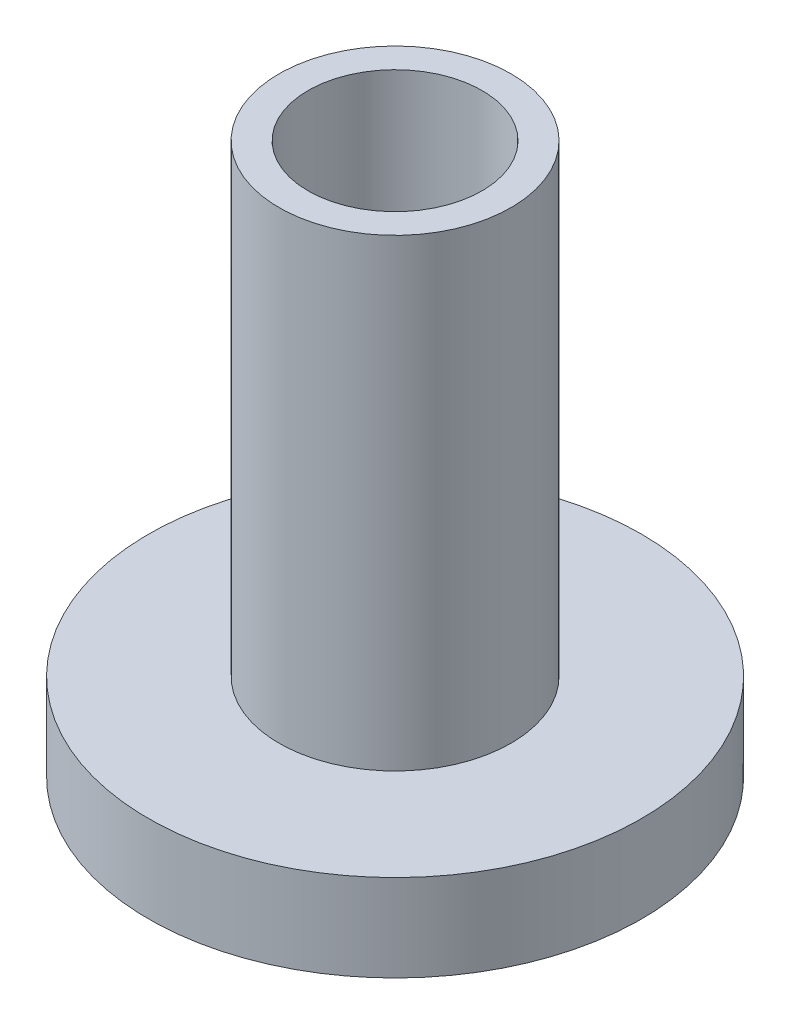
ISO-10303-21;
HEADER;
FILE_DESCRIPTION(('STEP AP214'),'2;1');
FILE_NAME('part.step','',(''),(''),'','','');
FILE_SCHEMA(('AUTOMOTIVE_DESIGN { 1 0 10303 214 1 1 1 1 }'));
ENDSEC;
DATA;
#1=APPLICATION_CONTEXT('core data for automotive mechanical design processes');
#2=APPLICATION_PROTOCOL_DEFINITION('international standard','automotive_design',2000,#1);
#3=PRODUCT_CONTEXT('',#1,'mechanical');
#4=PRODUCT('Part','Part','',(#3));
#5=PRODUCT_RELATED_PRODUCT_CATEGORY('part','',(#4));
#6=PRODUCT_DEFINITION_FORMATION('','',#4);
#7=PRODUCT_DEFINITION_CONTEXT('part definition',#1,'design');
#8=PRODUCT_DEFINITION('design','',#6,#7);
#9=PRODUCT_DEFINITION_SHAPE('','',#8);
#10=(LENGTH_UNIT() NAMED_UNIT(*) SI_UNIT(.MILLI.,.METRE.));
#11=(NAMED_UNIT(*) PLANE_ANGLE_UNIT() SI_UNIT($,.RADIAN.));
#12=(NAMED_UNIT(*) SI_UNIT($,.STERADIAN.) SOLID_ANGLE_UNIT());
#13=UNCERTAINTY_MEASURE_WITH_UNIT(LENGTH_MEASURE(1.E-05),#10,'distance_accuracy_value','');
#14=(GEOMETRIC_REPRESENTATION_CONTEXT(3) GLOBAL_UNCERTAINTY_ASSIGNED_CONTEXT((#13)) GLOBAL_UNIT_ASSIGNED_CONTEXT((#10,
#11,#12)) REPRESENTATION_CONTEXT('',''));
#15=CARTESIAN_POINT('',(0.,0.,0.));
#16=DIRECTION('',(0.,0.,1.));
#17=DIRECTION('',(1.,0.,0.));
#18=AXIS2_PLACEMENT_3D('',#15,#16,#17);
#19=CARTESIAN_POINT('',(0.,5.,0.));
#20=DIRECTION('',(0.,1.,0.));
#21=DIRECTION('',(0.,0.,1.));
#22=AXIS2_PLACEMENT_3D('',#19,#20,#21);
#23=PLANE('',#22);
#24=CARTESIAN_POINT('',(0.,5.,0.));
#25=DIRECTION('',(0.,1.,0.));
#26=DIRECTION('',(0.,0.,1.));
#27=AXIS2_PLACEMENT_3D('',#24,#25,#26);
#28=CIRCLE('',#27,1.5);
#29=CARTESIAN_POINT('',(0.,5.,1.5));
#30=VERTEX_POINT('',#29);
#31=EDGE_CURVE('E19',#30,#30,#28,.T.);
#32=ORIENTED_EDGE('',*,*,#31,.T.);
#33=EDGE_LOOP('',(#32));
#34=FACE_BOUND('',#33,.T.);
#35=ADVANCED_FACE('F16',(#34),#23,.T.);
#36=CARTESIAN_POINT('',(0.,5.,0.));
#37=DIRECTION('',(0.,1.,0.));
#38=DIRECTION('',(0.,0.,1.));
#39=AXIS2_PLACEMENT_3D('',#36,#37,#38);
#40=CYLINDRICAL_SURFACE('',#39,1.5);
#41=CARTESIAN_POINT('',(0.,9.5,0.));
#42=DIRECTION('',(0.,1.,0.));
#43=DIRECTION('',(0.,0.,1.));
#44=AXIS2_PLACEMENT_3D('',#41,#42,#43);
#45=CIRCLE('',#44,1.5);
#46=CARTESIAN_POINT('',(0.,9.5,1.5));
#47=VERTEX_POINT('',#46);
#48=EDGE_CURVE('E101',#47,#47,#45,.F.);
#49=ORIENTED_EDGE('',*,*,#48,.F.);
#50=EDGE_LOOP('',(#49));
#51=FACE_BOUND('',#50,.T.);
#52=ORIENTED_EDGE('',*,*,#31,.F.);
#53=EDGE_LOOP('',(#52));
#54=FACE_BOUND('',#53,.T.);
#55=ADVANCED_FACE('F109',(#51,#54),#40,.F.);
#56=CARTESIAN_POINT('',(0.,9.5,0.));
#57=DIRECTION('',(0.,1.,0.));
#58=DIRECTION('',(0.,0.,1.));
#59=AXIS2_PLACEMENT_3D('',#56,#57,#58);
#60=PLANE('',#59);
#61=CARTESIAN_POINT('',(0.,9.5,0.));
#62=DIRECTION('',(0.,-1.,0.));
#63=DIRECTION('',(0.,0.,-1.));
#64=AXIS2_PLACEMENT_3D('',#61,#62,#63);
#65=CIRCLE('',#64,2.);
#66=CARTESIAN_POINT('',(0.,9.5,-2.));
#67=VERTEX_POINT('',#66);
#68=EDGE_CURVE('E99',#67,#67,#65,.T.);
#69=ORIENTED_EDGE('',*,*,#68,.F.);
#70=EDGE_LOOP('',(#69));
#71=FACE_BOUND('',#70,.T.);
#72=ORIENTED_EDGE('',*,*,#48,.T.);
#73=EDGE_LOOP('',(#72));
#74=FACE_BOUND('',#73,.T.);
#75=ADVANCED_FACE('F111',(#71,#74),#60,.T.);
#76=CARTESIAN_POINT('',(0.,9.5,0.));
#77=DIRECTION('',(0.,-1.,0.));
#78=DIRECTION('',(0.,0.,-1.));
#79=AXIS2_PLACEMENT_3D('',#76,#77,#78);
#80=CYLINDRICAL_SURFACE('',#79,2.);
#81=CARTESIAN_POINT('',(0.,1.5,0.));
#82=DIRECTION('',(0.,-1.,0.));
#83=DIRECTION('',(0.,0.,-1.));
#84=AXIS2_PLACEMENT_3D('',#81,#82,#83);
#85=CIRCLE('',#84,2.);
#86=CARTESIAN_POINT('',(0.,1.5,-2.));
#87=VERTEX_POINT('',#86);
#88=EDGE_CURVE('E78',#87,#87,#85,.T.);
#89=ORIENTED_EDGE('',*,*,#88,.F.);
#90=EDGE_LOOP('',(#89));
#91=FACE_BOUND('',#90,.T.);
#92=ORIENTED_EDGE('',*,*,#68,.T.);
#93=EDGE_LOOP('',(#92));
#94=FACE_BOUND('',#93,.T.);
#95=ADVANCED_FACE('F118',(#91,#94),#80,.T.);
#96=CARTESIAN_POINT('',(0.,0.8,0.));
#97=DIRECTION('',(0.,-1.,0.));
#98=DIRECTION('',(0.,0.,-1.));
#99=AXIS2_PLACEMENT_3D('',#96,#97,#98);
#100=PLANE('',#99);
#101=DIRECTION('',(-0.5,0.,0.866025403784439));
#102=VECTOR('',#101,1.);
#103=CARTESIAN_POINT('',(-1.44337567297406,0.8,0.));
#104=LINE('',#103,#102);
#105=CARTESIAN_POINT('',(-1.44337567297406,0.8,0.));
#106=VERTEX_POINT('',#105);
#107=CARTESIAN_POINT('',(-0.721687836487032,0.8,-1.25));
#108=VERTEX_POINT('',#107);
#109=EDGE_CURVE('E262',#106,#108,#104,.F.);
#110=ORIENTED_EDGE('',*,*,#109,.T.);
#111=DIRECTION('',(-1.,0.,0.));
#112=VECTOR('',#111,1.);
#113=CARTESIAN_POINT('',(-0.721687836487032,0.8,-1.25));
#114=LINE('',#113,#112);
#115=CARTESIAN_POINT('',(0.721687836487033,0.8,-1.25));
#116=VERTEX_POINT('',#115);
#117=EDGE_CURVE('E268',#108,#116,#114,.F.);
#118=ORIENTED_EDGE('',*,*,#117,.T.);
#119=DIRECTION('',(-0.5,0.,-0.866025403784439));
#120=VECTOR('',#119,1.);
#121=CARTESIAN_POINT('',(0.721687836487033,0.8,-1.25));
#122=LINE('',#121,#120);
#123=CARTESIAN_POINT('',(1.44337567297406,0.8,0.));
#124=VERTEX_POINT('',#123);
#125=EDGE_CURVE('E276',#116,#124,#122,.F.);
#126=ORIENTED_EDGE('',*,*,#125,.T.);
#127=DIRECTION('',(0.5,0.,-0.866025403784439));
#128=VECTOR('',#127,1.);
#129=CARTESIAN_POINT('',(1.44337567297406,0.8,0.));
#130=LINE('',#129,#128);
#131=CARTESIAN_POINT('',(0.721687836487031,0.8,1.25));
#132=VERTEX_POINT('',#131);
#133=EDGE_CURVE('E72',#124,#132,#130,.F.);
#134=ORIENTED_EDGE('',*,*,#133,.T.);
#135=DIRECTION('',(1.,0.,0.));
#136=VECTOR('',#135,1.);
#137=CARTESIAN_POINT('',(0.721687836487031,0.8,1.25));
#138=LINE('',#137,#136);
#139=CARTESIAN_POINT('',(-0.721687836487032,0.8,1.25));
#140=VERTEX_POINT('',#139);
#141=EDGE_CURVE('E70',#132,#140,#138,.F.);
#142=ORIENTED_EDGE('',*,*,#141,.T.);
#143=DIRECTION('',(0.5,0.,0.866025403784439));
#144=VECTOR('',#143,1.);
#145=CARTESIAN_POINT('',(-0.721687836487033,0.8,1.25));
#146=LINE('',#145,#144);
#147=EDGE_CURVE('E67',#140,#106,#146,.F.);
#148=ORIENTED_EDGE('',*,*,#147,.T.);
#149=EDGE_LOOP('',(#110,#118,#126,#134,#142,#148));
#150=FACE_BOUND('',#149,.T.);
#151=ADVANCED_FACE('F71',(#150),#100,.T.);
#152=CARTESIAN_POINT('',(0.,1.5,0.));
#153=DIRECTION('',(0.,1.,0.));
#154=DIRECTION('',(0.,0.,1.));
#155=AXIS2_PLACEMENT_3D('',#152,#153,#154);
#156=PLANE('',#155);
#157=ORIENTED_EDGE('',*,*,#88,.T.);
#158=EDGE_LOOP('',(#157));
#159=FACE_BOUND('',#158,.T.);
#160=CARTESIAN_POINT('',(0.,1.5,0.));
#161=DIRECTION('',(0.,-1.,0.));
#162=DIRECTION('',(0.,0.,-1.));
#163=AXIS2_PLACEMENT_3D('',#160,#161,#162);
#164=CIRCLE('',#163,4.25);
#165=CARTESIAN_POINT('',(0.,1.5,-4.25));
#166=VERTEX_POINT('',#165);
#167=EDGE_CURVE('E93',#166,#166,#164,.T.);
#168=ORIENTED_EDGE('',*,*,#167,.F.);
#169=EDGE_LOOP('',(#168));
#170=FACE_BOUND('',#169,.T.);
#171=ADVANCED_FACE('F153',(#159,#170),#156,.T.);
#172=CARTESIAN_POINT('',(0.721687836487031,0.8,1.25));
#173=DIRECTION('',(0.,0.,1.));
#174=DIRECTION('',(1.,0.,0.));
#175=AXIS2_PLACEMENT_3D('',#172,#173,#174);
#176=PLANE('',#175);
#177=DIRECTION('',(0.,1.,0.));
#178=VECTOR('',#177,1.);
#179=CARTESIAN_POINT('',(-0.721687836487033,0.8,1.25));
#180=LINE('',#179,#178);
#181=CARTESIAN_POINT('',(-0.721687836487032,0.,1.25));
#182=VERTEX_POINT('',#181);
#183=EDGE_CURVE('E77',#182,#140,#180,.T.);
#184=ORIENTED_EDGE('',*,*,#183,.T.);
#185=ORIENTED_EDGE('',*,*,#141,.F.);
#186=DIRECTION('',(0.,1.,0.));
#187=VECTOR('',#186,1.);
#188=CARTESIAN_POINT('',(0.721687836487031,0.8,1.25));
#189=LINE('',#188,#187);
#190=CARTESIAN_POINT('',(0.721687836487031,0.,1.25));
#191=VERTEX_POINT('',#190);
#192=EDGE_CURVE('E96',#132,#191,#189,.F.);
#193=ORIENTED_EDGE('',*,*,#192,.T.);
#194=DIRECTION('',(1.,0.,0.));
#195=VECTOR('',#194,1.);
#196=CARTESIAN_POINT('',(0.,0.,1.25));
#197=LINE('',#196,#195);
#198=EDGE_CURVE('E89',#191,#182,#197,.F.);
#199=ORIENTED_EDGE('',*,*,#198,.T.);
#200=EDGE_LOOP('',(#184,#185,#193,#199));
#201=FACE_BOUND('',#200,.T.);
#202=ADVANCED_FACE('F88',(#201),#176,.F.);
#203=CARTESIAN_POINT('',(-0.721687836487033,0.8,1.25));
#204=DIRECTION('',(-0.866025403784439,0.,0.5));
#205=DIRECTION('',(0.5,0.,0.866025403784439));
#206=AXIS2_PLACEMENT_3D('',#203,#204,#205);
#207=PLANE('',#206);
#208=DIRECTION('',(0.,1.,0.));
#209=VECTOR('',#208,1.);
#210=CARTESIAN_POINT('',(-1.44337567297406,0.8,0.));
#211=LINE('',#210,#209);
#212=CARTESIAN_POINT('',(-1.44337567297406,0.,0.));
#213=VERTEX_POINT('',#212);
#214=EDGE_CURVE('E85',#213,#106,#211,.T.);
#215=ORIENTED_EDGE('',*,*,#214,.T.);
#216=ORIENTED_EDGE('',*,*,#147,.F.);
#217=ORIENTED_EDGE('',*,*,#183,.F.);
#218=DIRECTION('',(-0.5,0.,-0.866025403784439));
#219=VECTOR('',#218,1.);
#220=CARTESIAN_POINT('',(-0.721687836487033,0.,1.25));
#221=LINE('',#220,#219);
#222=EDGE_CURVE('E282',#182,#213,#221,.T.);
#223=ORIENTED_EDGE('',*,*,#222,.T.);
#224=EDGE_LOOP('',(#215,#216,#217,#223));
#225=FACE_BOUND('',#224,.T.);
#226=ADVANCED_FACE('F82',(#225),#207,.F.);
#227=CARTESIAN_POINT('',(-1.44337567297406,0.8,0.));
#228=DIRECTION('',(-0.866025403784439,0.,-0.5));
#229=DIRECTION('',(-0.5,0.,0.866025403784439));
#230=AXIS2_PLACEMENT_3D('',#227,#228,#229);
#231=PLANE('',#230);
#232=DIRECTION('',(0.,1.,0.));
#233=VECTOR('',#232,1.);
#234=CARTESIAN_POINT('',(-0.721687836487032,0.8,-1.25));
#235=LINE('',#234,#233);
#236=CARTESIAN_POINT('',(-0.721687836487032,0.,-1.25));
#237=VERTEX_POINT('',#236);
#238=EDGE_CURVE('E261',#237,#108,#235,.T.);
#239=ORIENTED_EDGE('',*,*,#238,.T.);
#240=ORIENTED_EDGE('',*,*,#109,.F.);
#241=ORIENTED_EDGE('',*,*,#214,.F.);
#242=DIRECTION('',(0.5,0.,-0.866025403784439));
#243=VECTOR('',#242,1.);
#244=CARTESIAN_POINT('',(-1.44337567297406,0.,0.));
#245=LINE('',#244,#243);
#246=EDGE_CURVE('E264',#213,#237,#245,.T.);
#247=ORIENTED_EDGE('',*,*,#246,.T.);
#248=EDGE_LOOP('',(#239,#240,#241,#247));
#249=FACE_BOUND('',#248,.T.);
#250=ADVANCED_FACE('F144',(#249),#231,.F.);
#251=CARTESIAN_POINT('',(-0.721687836487032,0.8,-1.25));
#252=DIRECTION('',(0.,0.,-1.));
#253=DIRECTION('',(-1.,0.,0.));
#254=AXIS2_PLACEMENT_3D('',#251,#252,#253);
#255=PLANE('',#254);
#256=DIRECTION('',(0.,1.,0.));
#257=VECTOR('',#256,1.);
#258=CARTESIAN_POINT('',(0.721687836487033,0.8,-1.25));
#259=LINE('',#258,#257);
#260=CARTESIAN_POINT('',(0.721687836487033,0.,-1.25));
#261=VERTEX_POINT('',#260);
#262=EDGE_CURVE('E270',#261,#116,#259,.T.);
#263=ORIENTED_EDGE('',*,*,#262,.T.);
#264=ORIENTED_EDGE('',*,*,#117,.F.);
#265=ORIENTED_EDGE('',*,*,#238,.F.);
#266=DIRECTION('',(1.,0.,0.));
#267=VECTOR('',#266,1.);
#268=CARTESIAN_POINT('',(0.,0.,-1.25));
#269=LINE('',#268,#267);
#270=EDGE_CURVE('E285',#237,#261,#269,.T.);
#271=ORIENTED_EDGE('',*,*,#270,.T.);
#272=EDGE_LOOP('',(#263,#264,#265,#271));
#273=FACE_BOUND('',#272,.T.);
#274=ADVANCED_FACE('F140',(#273),#255,.F.);
#275=CARTESIAN_POINT('',(0.721687836487033,0.8,-1.25));
#276=DIRECTION('',(0.866025403784439,0.,-0.5));
#277=DIRECTION('',(-0.5,0.,-0.866025403784439));
#278=AXIS2_PLACEMENT_3D('',#275,#276,#277);
#279=PLANE('',#278);
#280=DIRECTION('',(0.,1.,0.));
#281=VECTOR('',#280,1.);
#282=CARTESIAN_POINT('',(1.44337567297406,0.8,0.));
#283=LINE('',#282,#281);
#284=CARTESIAN_POINT('',(1.44337567297406,0.,0.));
#285=VERTEX_POINT('',#284);
#286=EDGE_CURVE('E34',#285,#124,#283,.T.);
#287=ORIENTED_EDGE('',*,*,#286,.T.);
#288=ORIENTED_EDGE('',*,*,#125,.F.);
#289=ORIENTED_EDGE('',*,*,#262,.F.);
#290=DIRECTION('',(0.5,0.,0.866025403784439));
#291=VECTOR('',#290,1.);
#292=CARTESIAN_POINT('',(0.721687836487033,0.,-1.25));
#293=LINE('',#292,#291);
#294=EDGE_CURVE('E287',#261,#285,#293,.T.);
#295=ORIENTED_EDGE('',*,*,#294,.T.);
#296=EDGE_LOOP('',(#287,#288,#289,#295));
#297=FACE_BOUND('',#296,.T.);
#298=ADVANCED_FACE('F137',(#297),#279,.F.);
#299=CARTESIAN_POINT('',(1.44337567297406,0.8,0.));
#300=DIRECTION('',(0.866025403784439,0.,0.5));
#301=DIRECTION('',(0.5,0.,-0.866025403784439));
#302=AXIS2_PLACEMENT_3D('',#299,#300,#301);
#303=PLANE('',#302);
#304=ORIENTED_EDGE('',*,*,#192,.F.);
#305=ORIENTED_EDGE('',*,*,#133,.F.);
#306=ORIENTED_EDGE('',*,*,#286,.F.);
#307=DIRECTION('',(-0.5,0.,0.866025403784439));
#308=VECTOR('',#307,1.);
#309=CARTESIAN_POINT('',(1.44337567297406,0.,0.));
#310=LINE('',#309,#308);
#311=EDGE_CURVE('E25',#285,#191,#310,.T.);
#312=ORIENTED_EDGE('',*,*,#311,.T.);
#313=EDGE_LOOP('',(#304,#305,#306,#312));
#314=FACE_BOUND('',#313,.T.);
#315=ADVANCED_FACE('F129',(#314),#303,.F.);
#316=CARTESIAN_POINT('',(0.,1.5,0.));
#317=DIRECTION('',(0.,-1.,0.));
#318=DIRECTION('',(0.,0.,-1.));
#319=AXIS2_PLACEMENT_3D('',#316,#317,#318);
#320=CYLINDRICAL_SURFACE('',#319,4.25);
#321=ORIENTED_EDGE('',*,*,#167,.T.);
#322=EDGE_LOOP('',(#321));
#323=FACE_BOUND('',#322,.T.);
#324=CARTESIAN_POINT('',(0.,0.,0.));
#325=DIRECTION('',(0.,-1.,0.));
#326=DIRECTION('',(0.,0.,-1.));
#327=AXIS2_PLACEMENT_3D('',#324,#325,#326);
#328=CIRCLE('',#327,4.25);
#329=CARTESIAN_POINT('',(0.,0.,-4.25));
#330=VERTEX_POINT('',#329);
#331=EDGE_CURVE('E11',#330,#330,#328,.F.);
#332=ORIENTED_EDGE('',*,*,#331,.T.);
#333=EDGE_LOOP('',(#332));
#334=FACE_BOUND('',#333,.T.);
#335=ADVANCED_FACE('F123',(#323,#334),#320,.T.);
#336=CARTESIAN_POINT('',(0.,0.,0.));
#337=DIRECTION('',(0.,1.,0.));
#338=DIRECTION('',(0.,0.,1.));
#339=AXIS2_PLACEMENT_3D('',#336,#337,#338);
#340=PLANE('',#339);
#341=ORIENTED_EDGE('',*,*,#331,.F.);
#342=EDGE_LOOP('',(#341));
#343=FACE_BOUND('',#342,.T.);
#344=ORIENTED_EDGE('',*,*,#294,.F.);
#345=ORIENTED_EDGE('',*,*,#270,.F.);
#346=ORIENTED_EDGE('',*,*,#246,.F.);
#347=ORIENTED_EDGE('',*,*,#222,.F.);
#348=ORIENTED_EDGE('',*,*,#198,.F.);
#349=ORIENTED_EDGE('',*,*,#311,.F.);
#350=EDGE_LOOP('',(#344,#345,#346,#347,#348,#349));
#351=FACE_BOUND('',#350,.T.);
#352=ADVANCED_FACE('F121',(#343,#351),#340,.F.);
#353=CLOSED_SHELL('',(#35,#55,#75,#95,#151,#171,#202,#226,#250,#274,#298,#315,#335,#352));
#354=MANIFOLD_SOLID_BREP('B1',#353);
#355=ADVANCED_BREP_SHAPE_REPRESENTATION('',(#18,#354),#14);
#356=SHAPE_DEFINITION_REPRESENTATION(#9,#355);
ENDSEC;
END-ISO-10303-21;
